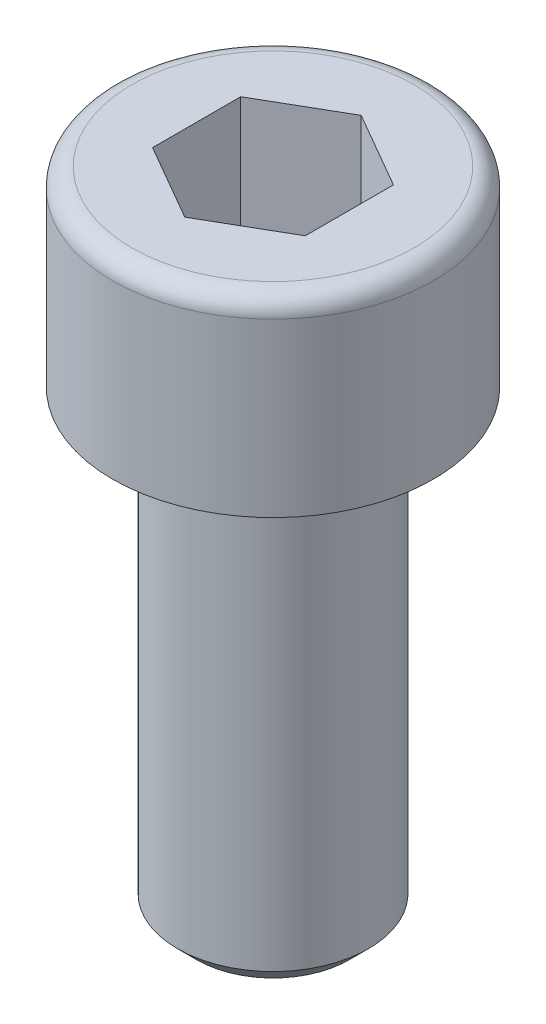
ISO-10303-21;
HEADER;
FILE_DESCRIPTION(('STEP AP214'),'2;1');
FILE_NAME('part.step','',(''),(''),'','','');
FILE_SCHEMA(('AUTOMOTIVE_DESIGN { 1 0 10303 214 1 1 1 1 }'));
ENDSEC;
DATA;
#1=APPLICATION_CONTEXT('core data for automotive mechanical design processes');
#2=APPLICATION_PROTOCOL_DEFINITION('international standard','automotive_design',2000,#1);
#3=PRODUCT_CONTEXT('',#1,'mechanical');
#4=PRODUCT('Part','Part','',(#3));
#5=PRODUCT_RELATED_PRODUCT_CATEGORY('part','',(#4));
#6=PRODUCT_DEFINITION_FORMATION('','',#4);
#7=PRODUCT_DEFINITION_CONTEXT('part definition',#1,'design');
#8=PRODUCT_DEFINITION('design','',#6,#7);
#9=PRODUCT_DEFINITION_SHAPE('','',#8);
#10=(LENGTH_UNIT() NAMED_UNIT(*) SI_UNIT(.MILLI.,.METRE.));
#11=(NAMED_UNIT(*) PLANE_ANGLE_UNIT() SI_UNIT($,.RADIAN.));
#12=(NAMED_UNIT(*) SI_UNIT($,.STERADIAN.) SOLID_ANGLE_UNIT());
#13=UNCERTAINTY_MEASURE_WITH_UNIT(LENGTH_MEASURE(1.E-05),#10,'distance_accuracy_value','');
#14=(GEOMETRIC_REPRESENTATION_CONTEXT(3) GLOBAL_UNCERTAINTY_ASSIGNED_CONTEXT((#13)) GLOBAL_UNIT_ASSIGNED_CONTEXT((#10,
#11,#12)) REPRESENTATION_CONTEXT('',''));
#15=CARTESIAN_POINT('',(0.,0.,0.));
#16=DIRECTION('',(0.,0.,1.));
#17=DIRECTION('',(1.,0.,0.));
#18=AXIS2_PLACEMENT_3D('',#15,#16,#17);
#19=CARTESIAN_POINT('',(0.,0.,0.));
#20=DIRECTION('',(0.,-1.,0.));
#21=DIRECTION('',(0.,0.,-1.));
#22=AXIS2_PLACEMENT_3D('',#19,#20,#21);
#23=PLANE('',#22);
#24=CARTESIAN_POINT('',(0.,0.,0.));
#25=DIRECTION('',(0.,-1.,0.));
#26=DIRECTION('',(0.,0.,-1.));
#27=AXIS2_PLACEMENT_3D('',#24,#25,#26);
#28=CIRCLE('',#27,3.7);
#29=CARTESIAN_POINT('',(0.,0.,-3.7));
#30=VERTEX_POINT('',#29);
#31=EDGE_CURVE('E43',#30,#30,#28,.F.);
#32=ORIENTED_EDGE('',*,*,#31,.T.);
#33=EDGE_LOOP('',(#32));
#34=FACE_BOUND('',#33,.T.);
#35=DIRECTION('',(-0.866025403784438,0.,-0.5));
#36=VECTOR('',#35,1.);
#37=CARTESIAN_POINT('',(2.,0.,-1.15470053837925));
#38=LINE('',#37,#36);
#39=CARTESIAN_POINT('',(2.,0.,-1.15470053837925));
#40=VERTEX_POINT('',#39);
#41=CARTESIAN_POINT('',(0.,0.,-2.3094010767585));
#42=VERTEX_POINT('',#41);
#43=EDGE_CURVE('E124',#40,#42,#38,.T.);
#44=ORIENTED_EDGE('',*,*,#43,.F.);
#45=DIRECTION('',(0.,0.,-1.));
#46=VECTOR('',#45,1.);
#47=CARTESIAN_POINT('',(2.,0.,1.15470053837925));
#48=LINE('',#47,#46);
#49=CARTESIAN_POINT('',(2.,0.,1.15470053837925));
#50=VERTEX_POINT('',#49);
#51=EDGE_CURVE('E50',#50,#40,#48,.T.);
#52=ORIENTED_EDGE('',*,*,#51,.F.);
#53=DIRECTION('',(0.866025403784438,0.,-0.5));
#54=VECTOR('',#53,1.);
#55=CARTESIAN_POINT('',(0.,0.,2.3094010767585));
#56=LINE('',#55,#54);
#57=CARTESIAN_POINT('',(0.,0.,2.3094010767585));
#58=VERTEX_POINT('',#57);
#59=EDGE_CURVE('E133',#58,#50,#56,.T.);
#60=ORIENTED_EDGE('',*,*,#59,.F.);
#61=DIRECTION('',(0.866025403784438,0.,0.5));
#62=VECTOR('',#61,1.);
#63=CARTESIAN_POINT('',(-2.,0.,1.15470053837925));
#64=LINE('',#63,#62);
#65=CARTESIAN_POINT('',(-2.,0.,1.15470053837925));
#66=VERTEX_POINT('',#65);
#67=EDGE_CURVE('E131',#66,#58,#64,.T.);
#68=ORIENTED_EDGE('',*,*,#67,.F.);
#69=DIRECTION('',(0.,0.,1.));
#70=VECTOR('',#69,1.);
#71=CARTESIAN_POINT('',(-2.,0.,-1.15470053837925));
#72=LINE('',#71,#70);
#73=CARTESIAN_POINT('',(-2.,0.,-1.15470053837925));
#74=VERTEX_POINT('',#73);
#75=EDGE_CURVE('E98',#74,#66,#72,.T.);
#76=ORIENTED_EDGE('',*,*,#75,.F.);
#77=DIRECTION('',(-0.866025403784439,0.,0.5));
#78=VECTOR('',#77,1.);
#79=CARTESIAN_POINT('',(0.,0.,-2.3094010767585));
#80=LINE('',#79,#78);
#81=EDGE_CURVE('E127',#42,#74,#80,.T.);
#82=ORIENTED_EDGE('',*,*,#81,.F.);
#83=EDGE_LOOP('',(#44,#52,#60,#68,#76,#82));
#84=FACE_BOUND('',#83,.T.);
#85=ADVANCED_FACE('F35',(#34,#84),#23,.F.);
#86=CARTESIAN_POINT('',(0.,0.,0.));
#87=DIRECTION('',(0.,1.,0.));
#88=DIRECTION('',(0.,0.,1.));
#89=AXIS2_PLACEMENT_3D('',#86,#87,#88);
#90=CYLINDRICAL_SURFACE('',#89,4.2);
#91=CARTESIAN_POINT('',(0.,-0.5,0.));
#92=DIRECTION('',(0.,-1.,0.));
#93=DIRECTION('',(0.,0.,-1.));
#94=AXIS2_PLACEMENT_3D('',#91,#92,#93);
#95=CIRCLE('',#94,4.2);
#96=CARTESIAN_POINT('',(0.,-0.5,-4.2));
#97=VERTEX_POINT('',#96);
#98=EDGE_CURVE('E11',#97,#97,#95,.T.);
#99=ORIENTED_EDGE('',*,*,#98,.T.);
#100=EDGE_LOOP('',(#99));
#101=FACE_BOUND('',#100,.T.);
#102=CARTESIAN_POINT('',(0.,-5.,0.));
#103=DIRECTION('',(0.,1.,0.));
#104=DIRECTION('',(0.,0.,1.));
#105=AXIS2_PLACEMENT_3D('',#102,#103,#104);
#106=CIRCLE('',#105,4.2);
#107=CARTESIAN_POINT('',(0.,-5.,4.2));
#108=VERTEX_POINT('',#107);
#109=EDGE_CURVE('E145',#108,#108,#106,.T.);
#110=ORIENTED_EDGE('',*,*,#109,.T.);
#111=EDGE_LOOP('',(#110));
#112=FACE_BOUND('',#111,.T.);
#113=ADVANCED_FACE('F167',(#101,#112),#90,.T.);
#114=CARTESIAN_POINT('',(4.2,-5.,0.));
#115=DIRECTION('',(0.,1.,0.));
#116=DIRECTION('',(0.,0.,1.));
#117=AXIS2_PLACEMENT_3D('',#114,#115,#116);
#118=PLANE('',#117);
#119=ORIENTED_EDGE('',*,*,#109,.F.);
#120=EDGE_LOOP('',(#119));
#121=FACE_BOUND('',#120,.T.);
#122=CARTESIAN_POINT('',(0.,-5.,0.));
#123=DIRECTION('',(0.,1.,0.));
#124=DIRECTION('',(0.,0.,1.));
#125=AXIS2_PLACEMENT_3D('',#122,#123,#124);
#126=CIRCLE('',#125,2.5);
#127=CARTESIAN_POINT('',(0.,-5.,2.5));
#128=VERTEX_POINT('',#127);
#129=EDGE_CURVE('E137',#128,#128,#126,.T.);
#130=ORIENTED_EDGE('',*,*,#129,.T.);
#131=EDGE_LOOP('',(#130));
#132=FACE_BOUND('',#131,.T.);
#133=ADVANCED_FACE('F172',(#121,#132),#118,.F.);
#134=CARTESIAN_POINT('',(0.,0.,0.));
#135=DIRECTION('',(0.,1.,0.));
#136=DIRECTION('',(0.,0.,1.));
#137=AXIS2_PLACEMENT_3D('',#134,#135,#136);
#138=CYLINDRICAL_SURFACE('',#137,2.5);
#139=CARTESIAN_POINT('',(0.,-16.5,0.));
#140=DIRECTION('',(0.,1.,0.));
#141=DIRECTION('',(0.,0.,1.));
#142=AXIS2_PLACEMENT_3D('',#139,#140,#141);
#143=CIRCLE('',#142,2.5);
#144=CARTESIAN_POINT('',(0.,-16.5,2.5));
#145=VERTEX_POINT('',#144);
#146=EDGE_CURVE('E148',#145,#145,#143,.T.);
#147=ORIENTED_EDGE('',*,*,#146,.T.);
#148=EDGE_LOOP('',(#147));
#149=FACE_BOUND('',#148,.T.);
#150=ORIENTED_EDGE('',*,*,#129,.F.);
#151=EDGE_LOOP('',(#150));
#152=FACE_BOUND('',#151,.T.);
#153=ADVANCED_FACE('F178',(#149,#152),#138,.T.);
#154=CARTESIAN_POINT('',(2.5,-17.,0.));
#155=DIRECTION('',(0.,1.,0.));
#156=DIRECTION('',(0.,0.,1.));
#157=AXIS2_PLACEMENT_3D('',#154,#155,#156);
#158=PLANE('',#157);
#159=CARTESIAN_POINT('',(0.,-17.,0.));
#160=DIRECTION('',(0.,1.,0.));
#161=DIRECTION('',(0.,0.,1.));
#162=AXIS2_PLACEMENT_3D('',#159,#160,#161);
#163=CIRCLE('',#162,2.);
#164=CARTESIAN_POINT('',(0.,-17.,2.));
#165=VERTEX_POINT('',#164);
#166=EDGE_CURVE('E151',#165,#165,#163,.F.);
#167=ORIENTED_EDGE('',*,*,#166,.T.);
#168=EDGE_LOOP('',(#167));
#169=FACE_BOUND('',#168,.T.);
#170=ADVANCED_FACE('F182',(#169),#158,.F.);
#171=CARTESIAN_POINT('',(2.,-3.,1.15470053837925));
#172=DIRECTION('',(1.,0.,0.));
#173=DIRECTION('',(0.,0.,-1.));
#174=AXIS2_PLACEMENT_3D('',#171,#172,#173);
#175=PLANE('',#174);
#176=ORIENTED_EDGE('',*,*,#51,.T.);
#177=DIRECTION('',(0.,1.,0.));
#178=VECTOR('',#177,1.);
#179=CARTESIAN_POINT('',(2.,-3.,-1.15470053837925));
#180=LINE('',#179,#178);
#181=CARTESIAN_POINT('',(2.,-3.,-1.15470053837925));
#182=VERTEX_POINT('',#181);
#183=EDGE_CURVE('E80',#182,#40,#180,.T.);
#184=ORIENTED_EDGE('',*,*,#183,.F.);
#185=DIRECTION('',(0.,0.,-1.));
#186=VECTOR('',#185,1.);
#187=CARTESIAN_POINT('',(2.,-3.,1.15470053837925));
#188=LINE('',#187,#186);
#189=CARTESIAN_POINT('',(2.,-3.,1.15470053837925));
#190=VERTEX_POINT('',#189);
#191=EDGE_CURVE('E135',#190,#182,#188,.T.);
#192=ORIENTED_EDGE('',*,*,#191,.F.);
#193=DIRECTION('',(0.,1.,0.));
#194=VECTOR('',#193,1.);
#195=CARTESIAN_POINT('',(2.,-3.,1.15470053837925));
#196=LINE('',#195,#194);
#197=EDGE_CURVE('E58',#190,#50,#196,.T.);
#198=ORIENTED_EDGE('',*,*,#197,.T.);
#199=EDGE_LOOP('',(#176,#184,#192,#198));
#200=FACE_BOUND('',#199,.T.);
#201=ADVANCED_FACE('F186',(#200),#175,.F.);
#202=CARTESIAN_POINT('',(0.,-3.,2.3094010767585));
#203=DIRECTION('',(0.5,0.,0.866025403784439));
#204=DIRECTION('',(0.866025403784439,0.,-0.5));
#205=AXIS2_PLACEMENT_3D('',#202,#203,#204);
#206=PLANE('',#205);
#207=ORIENTED_EDGE('',*,*,#59,.T.);
#208=ORIENTED_EDGE('',*,*,#197,.F.);
#209=DIRECTION('',(0.866025403784438,0.,-0.5));
#210=VECTOR('',#209,1.);
#211=CARTESIAN_POINT('',(0.,-3.,2.3094010767585));
#212=LINE('',#211,#210);
#213=CARTESIAN_POINT('',(0.,-3.,2.3094010767585));
#214=VERTEX_POINT('',#213);
#215=EDGE_CURVE('E110',#214,#190,#212,.T.);
#216=ORIENTED_EDGE('',*,*,#215,.F.);
#217=DIRECTION('',(0.,1.,0.));
#218=VECTOR('',#217,1.);
#219=CARTESIAN_POINT('',(0.,-3.,2.3094010767585));
#220=LINE('',#219,#218);
#221=EDGE_CURVE('E102',#214,#58,#220,.T.);
#222=ORIENTED_EDGE('',*,*,#221,.T.);
#223=EDGE_LOOP('',(#207,#208,#216,#222));
#224=FACE_BOUND('',#223,.T.);
#225=ADVANCED_FACE('F190',(#224),#206,.F.);
#226=CARTESIAN_POINT('',(-2.,-3.,1.15470053837925));
#227=DIRECTION('',(-0.5,0.,0.866025403784439));
#228=DIRECTION('',(0.866025403784439,0.,0.5));
#229=AXIS2_PLACEMENT_3D('',#226,#227,#228);
#230=PLANE('',#229);
#231=ORIENTED_EDGE('',*,*,#67,.T.);
#232=ORIENTED_EDGE('',*,*,#221,.F.);
#233=DIRECTION('',(0.866025403784438,0.,0.5));
#234=VECTOR('',#233,1.);
#235=CARTESIAN_POINT('',(-2.,-3.,1.15470053837925));
#236=LINE('',#235,#234);
#237=CARTESIAN_POINT('',(-2.,-3.,1.15470053837925));
#238=VERTEX_POINT('',#237);
#239=EDGE_CURVE('E106',#238,#214,#236,.T.);
#240=ORIENTED_EDGE('',*,*,#239,.F.);
#241=DIRECTION('',(0.,1.,0.));
#242=VECTOR('',#241,1.);
#243=CARTESIAN_POINT('',(-2.,-3.,1.15470053837925));
#244=LINE('',#243,#242);
#245=EDGE_CURVE('E91',#238,#66,#244,.T.);
#246=ORIENTED_EDGE('',*,*,#245,.T.);
#247=EDGE_LOOP('',(#231,#232,#240,#246));
#248=FACE_BOUND('',#247,.T.);
#249=ADVANCED_FACE('F107',(#248),#230,.F.);
#250=CARTESIAN_POINT('',(-2.,-3.,-1.15470053837925));
#251=DIRECTION('',(-1.,0.,0.));
#252=DIRECTION('',(0.,0.,1.));
#253=AXIS2_PLACEMENT_3D('',#250,#251,#252);
#254=PLANE('',#253);
#255=ORIENTED_EDGE('',*,*,#75,.T.);
#256=ORIENTED_EDGE('',*,*,#245,.F.);
#257=DIRECTION('',(0.,0.,1.));
#258=VECTOR('',#257,1.);
#259=CARTESIAN_POINT('',(-2.,-3.,-1.15470053837925));
#260=LINE('',#259,#258);
#261=CARTESIAN_POINT('',(-2.,-3.,-1.15470053837925));
#262=VERTEX_POINT('',#261);
#263=EDGE_CURVE('E95',#262,#238,#260,.T.);
#264=ORIENTED_EDGE('',*,*,#263,.F.);
#265=DIRECTION('',(0.,1.,0.));
#266=VECTOR('',#265,1.);
#267=CARTESIAN_POINT('',(-2.,-3.,-1.15470053837925));
#268=LINE('',#267,#266);
#269=EDGE_CURVE('E103',#262,#74,#268,.T.);
#270=ORIENTED_EDGE('',*,*,#269,.T.);
#271=EDGE_LOOP('',(#255,#256,#264,#270));
#272=FACE_BOUND('',#271,.T.);
#273=ADVANCED_FACE('F93',(#272),#254,.F.);
#274=CARTESIAN_POINT('',(0.,-3.,-2.3094010767585));
#275=DIRECTION('',(-0.5,0.,-0.866025403784439));
#276=DIRECTION('',(-0.866025403784439,0.,0.5));
#277=AXIS2_PLACEMENT_3D('',#274,#275,#276);
#278=PLANE('',#277);
#279=ORIENTED_EDGE('',*,*,#81,.T.);
#280=ORIENTED_EDGE('',*,*,#269,.F.);
#281=DIRECTION('',(-0.866025403784439,0.,0.5));
#282=VECTOR('',#281,1.);
#283=CARTESIAN_POINT('',(0.,-3.,-2.3094010767585));
#284=LINE('',#283,#282);
#285=CARTESIAN_POINT('',(0.,-3.,-2.3094010767585));
#286=VERTEX_POINT('',#285);
#287=EDGE_CURVE('E116',#286,#262,#284,.T.);
#288=ORIENTED_EDGE('',*,*,#287,.F.);
#289=DIRECTION('',(0.,1.,0.));
#290=VECTOR('',#289,1.);
#291=CARTESIAN_POINT('',(0.,-3.,-2.3094010767585));
#292=LINE('',#291,#290);
#293=EDGE_CURVE('E140',#286,#42,#292,.T.);
#294=ORIENTED_EDGE('',*,*,#293,.T.);
#295=EDGE_LOOP('',(#279,#280,#288,#294));
#296=FACE_BOUND('',#295,.T.);
#297=ADVANCED_FACE('F194',(#296),#278,.F.);
#298=CARTESIAN_POINT('',(2.,-3.,-1.15470053837925));
#299=DIRECTION('',(0.5,0.,-0.866025403784439));
#300=DIRECTION('',(-0.866025403784439,0.,-0.5));
#301=AXIS2_PLACEMENT_3D('',#298,#299,#300);
#302=PLANE('',#301);
#303=ORIENTED_EDGE('',*,*,#43,.T.);
#304=ORIENTED_EDGE('',*,*,#293,.F.);
#305=DIRECTION('',(-0.866025403784438,0.,-0.5));
#306=VECTOR('',#305,1.);
#307=CARTESIAN_POINT('',(2.,-3.,-1.15470053837925));
#308=LINE('',#307,#306);
#309=EDGE_CURVE('E118',#182,#286,#308,.T.);
#310=ORIENTED_EDGE('',*,*,#309,.F.);
#311=ORIENTED_EDGE('',*,*,#183,.T.);
#312=EDGE_LOOP('',(#303,#304,#310,#311));
#313=FACE_BOUND('',#312,.T.);
#314=ADVANCED_FACE('F191',(#313),#302,.F.);
#315=CARTESIAN_POINT('',(2.,-3.,-1.15470053837925));
#316=DIRECTION('',(0.,1.,0.));
#317=DIRECTION('',(0.,0.,1.));
#318=AXIS2_PLACEMENT_3D('',#315,#316,#317);
#319=PLANE('',#318);
#320=ORIENTED_EDGE('',*,*,#191,.T.);
#321=ORIENTED_EDGE('',*,*,#309,.T.);
#322=ORIENTED_EDGE('',*,*,#287,.T.);
#323=ORIENTED_EDGE('',*,*,#263,.T.);
#324=ORIENTED_EDGE('',*,*,#239,.T.);
#325=ORIENTED_EDGE('',*,*,#215,.T.);
#326=EDGE_LOOP('',(#320,#321,#322,#323,#324,#325));
#327=FACE_BOUND('',#326,.T.);
#328=ADVANCED_FACE('F113',(#327),#319,.T.);
#329=CARTESIAN_POINT('',(0.,-16.5,0.));
#330=DIRECTION('',(0.,1.,0.));
#331=DIRECTION('',(0.,0.,1.));
#332=AXIS2_PLACEMENT_3D('',#329,#330,#331);
#333=CONICAL_SURFACE('',#332,2.5,0.785398163397453);
#334=ORIENTED_EDGE('',*,*,#166,.F.);
#335=EDGE_LOOP('',(#334));
#336=FACE_BOUND('',#335,.T.);
#337=ORIENTED_EDGE('',*,*,#146,.F.);
#338=EDGE_LOOP('',(#337));
#339=FACE_BOUND('',#338,.T.);
#340=ADVANCED_FACE('F159',(#336,#339),#333,.T.);
#341=CARTESIAN_POINT('',(0.,-0.5,0.));
#342=DIRECTION('',(0.,-1.,0.));
#343=DIRECTION('',(0.,0.,-1.));
#344=AXIS2_PLACEMENT_3D('',#341,#342,#343);
#345=TOROIDAL_SURFACE('',#344,3.7,0.5);
#346=ORIENTED_EDGE('',*,*,#98,.F.);
#347=EDGE_LOOP('',(#346));
#348=FACE_BOUND('',#347,.T.);
#349=ORIENTED_EDGE('',*,*,#31,.F.);
#350=EDGE_LOOP('',(#349));
#351=FACE_BOUND('',#350,.T.);
#352=ADVANCED_FACE('F37',(#348,#351),#345,.T.);
#353=CLOSED_SHELL('',(#85,#113,#133,#153,#170,#201,#225,#249,#273,#297,#314,#328,#340,#352));
#354=MANIFOLD_SOLID_BREP('B2',#353);
#355=ADVANCED_BREP_SHAPE_REPRESENTATION('',(#18,#354),#14);
#356=SHAPE_DEFINITION_REPRESENTATION(#9,#355);
ENDSEC;
END-ISO-10303-21;
